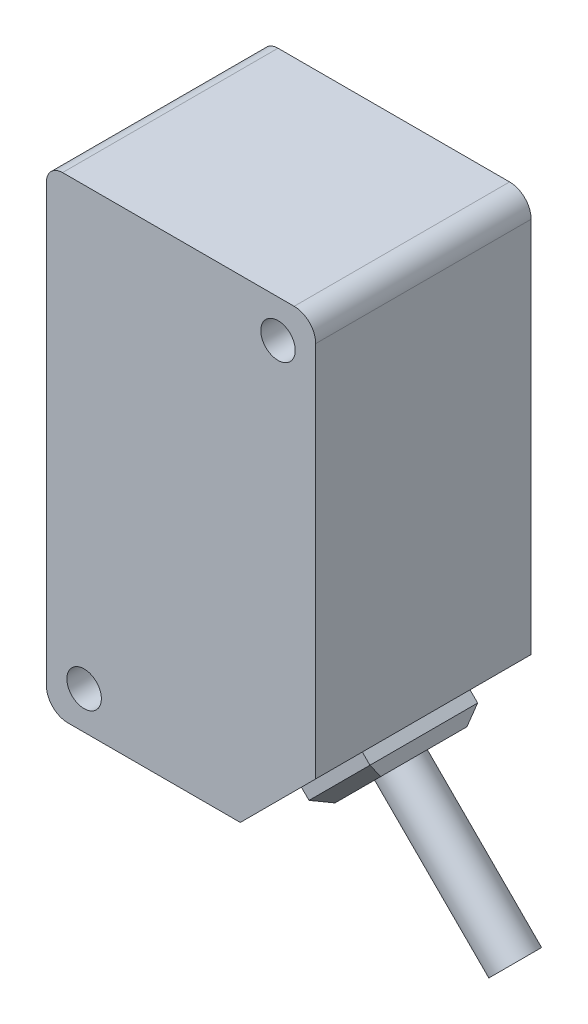
ISO-10303-21;
HEADER;
FILE_DESCRIPTION(('STEP AP214'),'2;1');
FILE_NAME('part.step','',(''),(''),'','','');
FILE_SCHEMA(('AUTOMOTIVE_DESIGN { 1 0 10303 214 1 1 1 1 }'));
ENDSEC;
DATA;
#1=APPLICATION_CONTEXT('core data for automotive mechanical design processes');
#2=APPLICATION_PROTOCOL_DEFINITION('international standard','automotive_design',2000,#1);
#3=PRODUCT_CONTEXT('',#1,'mechanical');
#4=PRODUCT('Part','Part','',(#3));
#5=PRODUCT_RELATED_PRODUCT_CATEGORY('part','',(#4));
#6=PRODUCT_DEFINITION_FORMATION('','',#4);
#7=PRODUCT_DEFINITION_CONTEXT('part definition',#1,'design');
#8=PRODUCT_DEFINITION('design','',#6,#7);
#9=PRODUCT_DEFINITION_SHAPE('','',#8);
#10=(LENGTH_UNIT() NAMED_UNIT(*) SI_UNIT(.MILLI.,.METRE.));
#11=(NAMED_UNIT(*) PLANE_ANGLE_UNIT() SI_UNIT($,.RADIAN.));
#12=(NAMED_UNIT(*) SI_UNIT($,.STERADIAN.) SOLID_ANGLE_UNIT());
#13=UNCERTAINTY_MEASURE_WITH_UNIT(LENGTH_MEASURE(1.E-05),#10,'distance_accuracy_value','');
#14=(GEOMETRIC_REPRESENTATION_CONTEXT(3) GLOBAL_UNCERTAINTY_ASSIGNED_CONTEXT((#13)) GLOBAL_UNIT_ASSIGNED_CONTEXT((#10,
#11,#12)) REPRESENTATION_CONTEXT('',''));
#15=CARTESIAN_POINT('',(0.,0.,0.));
#16=DIRECTION('',(0.,0.,1.));
#17=DIRECTION('',(1.,0.,0.));
#18=AXIS2_PLACEMENT_3D('',#15,#16,#17);
#19=CARTESIAN_POINT('',(18.,0.,20.));
#20=DIRECTION('',(-0.707106781186549,0.707106781186546,0.));
#21=DIRECTION('',(-0.707106781186546,-0.707106781186549,0.));
#22=AXIS2_PLACEMENT_3D('',#19,#20,#21);
#23=PLANE('',#22);
#24=DIRECTION('',(0.707106781186546,0.707106781186549,0.));
#25=VECTOR('',#24,1.);
#26=CARTESIAN_POINT('',(18.,0.,0.));
#27=LINE('',#26,#25);
#28=CARTESIAN_POINT('',(18.,0.,0.));
#29=VERTEX_POINT('',#28);
#30=CARTESIAN_POINT('',(25.,7.00000000000002,0.));
#31=VERTEX_POINT('',#30);
#32=EDGE_CURVE('E225',#29,#31,#27,.T.);
#33=ORIENTED_EDGE('',*,*,#32,.T.);
#34=DIRECTION('',(0.,0.,-1.));
#35=VECTOR('',#34,1.);
#36=CARTESIAN_POINT('',(25.,7.00000000000002,20.));
#37=LINE('',#36,#35);
#38=CARTESIAN_POINT('',(25.,7.00000000000002,20.));
#39=VERTEX_POINT('',#38);
#40=EDGE_CURVE('E222',#39,#31,#37,.T.);
#41=ORIENTED_EDGE('',*,*,#40,.F.);
#42=DIRECTION('',(0.707106781186546,0.707106781186549,0.));
#43=VECTOR('',#42,1.);
#44=CARTESIAN_POINT('',(18.,0.,20.));
#45=LINE('',#44,#43);
#46=CARTESIAN_POINT('',(18.,0.,20.));
#47=VERTEX_POINT('',#46);
#48=EDGE_CURVE('E207',#47,#39,#45,.T.);
#49=ORIENTED_EDGE('',*,*,#48,.F.);
#50=DIRECTION('',(0.,0.,-1.));
#51=VECTOR('',#50,1.);
#52=CARTESIAN_POINT('',(18.,0.,20.));
#53=LINE('',#52,#51);
#54=EDGE_CURVE('E241',#47,#29,#53,.T.);
#55=ORIENTED_EDGE('',*,*,#54,.T.);
#56=EDGE_LOOP('',(#33,#41,#49,#55));
#57=FACE_BOUND('',#56,.T.);
#58=DIRECTION('',(0.707106781186547,0.707106781186549,0.));
#59=VECTOR('',#58,1.);
#60=CARTESIAN_POINT('',(24.3284271247462,6.32842712474619,5.));
#61=LINE('',#60,#59);
#62=CARTESIAN_POINT('',(18.6715728752538,0.671572875253804,5.));
#63=VERTEX_POINT('',#62);
#64=CARTESIAN_POINT('',(24.3284271247462,6.32842712474619,5.));
#65=VERTEX_POINT('',#64);
#66=EDGE_CURVE('E146',#63,#65,#61,.T.);
#67=ORIENTED_EDGE('',*,*,#66,.F.);
#68=DIRECTION('',(0.,0.,-1.));
#69=VECTOR('',#68,1.);
#70=CARTESIAN_POINT('',(18.6715728752538,0.671572875253804,15.));
#71=LINE('',#70,#69);
#72=CARTESIAN_POINT('',(18.6715728752538,0.671572875253802,15.));
#73=VERTEX_POINT('',#72);
#74=EDGE_CURVE('E152',#73,#63,#71,.T.);
#75=ORIENTED_EDGE('',*,*,#74,.F.);
#76=DIRECTION('',(-0.707106781186547,-0.707106781186549,0.));
#77=VECTOR('',#76,1.);
#78=CARTESIAN_POINT('',(24.3284271247462,6.32842712474619,15.));
#79=LINE('',#78,#77);
#80=CARTESIAN_POINT('',(24.3284271247462,6.32842712474619,15.));
#81=VERTEX_POINT('',#80);
#82=EDGE_CURVE('E165',#81,#73,#79,.T.);
#83=ORIENTED_EDGE('',*,*,#82,.F.);
#84=DIRECTION('',(0.,0.,1.));
#85=VECTOR('',#84,1.);
#86=CARTESIAN_POINT('',(24.3284271247462,6.32842712474619,15.));
#87=LINE('',#86,#85);
#88=EDGE_CURVE('E160',#65,#81,#87,.T.);
#89=ORIENTED_EDGE('',*,*,#88,.F.);
#90=EDGE_LOOP('',(#67,#75,#83,#89));
#91=FACE_BOUND('',#90,.T.);
#92=ADVANCED_FACE('F39',(#57,#91),#23,.F.);
#93=CARTESIAN_POINT('',(0.,0.,20.));
#94=DIRECTION('',(0.,0.,1.));
#95=DIRECTION('',(1.,0.,0.));
#96=AXIS2_PLACEMENT_3D('',#93,#94,#95);
#97=PLANE('',#96);
#98=CARTESIAN_POINT('',(21.5,40.5,20.));
#99=DIRECTION('',(0.,0.,1.));
#100=DIRECTION('',(1.,0.,0.));
#101=AXIS2_PLACEMENT_3D('',#98,#99,#100);
#102=CIRCLE('',#101,1.6);
#103=CARTESIAN_POINT('',(23.1,40.5,20.));
#104=VERTEX_POINT('',#103);
#105=EDGE_CURVE('E196',#104,#104,#102,.T.);
#106=ORIENTED_EDGE('',*,*,#105,.F.);
#107=EDGE_LOOP('',(#106));
#108=FACE_BOUND('',#107,.T.);
#109=DIRECTION('',(0.,-1.,0.));
#110=VECTOR('',#109,1.);
#111=CARTESIAN_POINT('',(0.,0.,20.));
#112=LINE('',#111,#110);
#113=CARTESIAN_POINT('',(0.,42.5,20.));
#114=VERTEX_POINT('',#113);
#115=CARTESIAN_POINT('',(0.,2.,20.));
#116=VERTEX_POINT('',#115);
#117=EDGE_CURVE('E218',#114,#116,#112,.T.);
#118=ORIENTED_EDGE('',*,*,#117,.T.);
#119=CARTESIAN_POINT('',(2.,2.,20.));
#120=DIRECTION('',(0.,0.,1.));
#121=DIRECTION('',(1.,0.,0.));
#122=AXIS2_PLACEMENT_3D('',#119,#120,#121);
#123=CIRCLE('',#122,2.);
#124=CARTESIAN_POINT('',(2.,0.,20.));
#125=VERTEX_POINT('',#124);
#126=EDGE_CURVE('E276',#116,#125,#123,.T.);
#127=ORIENTED_EDGE('',*,*,#126,.T.);
#128=DIRECTION('',(1.,0.,0.));
#129=VECTOR('',#128,1.);
#130=CARTESIAN_POINT('',(0.,0.,20.));
#131=LINE('',#130,#129);
#132=EDGE_CURVE('E204',#125,#47,#131,.T.);
#133=ORIENTED_EDGE('',*,*,#132,.T.);
#134=ORIENTED_EDGE('',*,*,#48,.T.);
#135=DIRECTION('',(0.,1.,0.));
#136=VECTOR('',#135,1.);
#137=CARTESIAN_POINT('',(25.,7.00000000000002,20.));
#138=LINE('',#137,#136);
#139=CARTESIAN_POINT('',(25.,42.,20.));
#140=VERTEX_POINT('',#139);
#141=EDGE_CURVE('E211',#39,#140,#138,.T.);
#142=ORIENTED_EDGE('',*,*,#141,.T.);
#143=CARTESIAN_POINT('',(23.,42.,20.));
#144=DIRECTION('',(0.,0.,1.));
#145=DIRECTION('',(1.,0.,0.));
#146=AXIS2_PLACEMENT_3D('',#143,#144,#145);
#147=CIRCLE('',#146,2.);
#148=CARTESIAN_POINT('',(23.,44.,20.));
#149=VERTEX_POINT('',#148);
#150=EDGE_CURVE('E273',#140,#149,#147,.T.);
#151=ORIENTED_EDGE('',*,*,#150,.T.);
#152=DIRECTION('',(-1.,0.,0.));
#153=VECTOR('',#152,1.);
#154=CARTESIAN_POINT('',(0.,44.,20.));
#155=LINE('',#154,#153);
#156=CARTESIAN_POINT('',(1.49999999999999,44.,20.));
#157=VERTEX_POINT('',#156);
#158=EDGE_CURVE('E215',#149,#157,#155,.T.);
#159=ORIENTED_EDGE('',*,*,#158,.T.);
#160=CARTESIAN_POINT('',(1.49999999999999,42.5,20.));
#161=DIRECTION('',(0.,0.,1.));
#162=DIRECTION('',(1.,0.,0.));
#163=AXIS2_PLACEMENT_3D('',#160,#161,#162);
#164=CIRCLE('',#163,1.5);
#165=EDGE_CURVE('E257',#157,#114,#164,.T.);
#166=ORIENTED_EDGE('',*,*,#165,.T.);
#167=EDGE_LOOP('',(#118,#127,#133,#134,#142,#151,#159,#166));
#168=FACE_BOUND('',#167,.T.);
#169=CARTESIAN_POINT('',(3.5,3.5,20.));
#170=DIRECTION('',(0.,0.,1.));
#171=DIRECTION('',(1.,0.,0.));
#172=AXIS2_PLACEMENT_3D('',#169,#170,#171);
#173=CIRCLE('',#172,1.6);
#174=CARTESIAN_POINT('',(5.1,3.5,20.));
#175=VERTEX_POINT('',#174);
#176=EDGE_CURVE('E188',#175,#175,#173,.T.);
#177=ORIENTED_EDGE('',*,*,#176,.F.);
#178=EDGE_LOOP('',(#177));
#179=FACE_BOUND('',#178,.T.);
#180=ADVANCED_FACE('F348',(#108,#168,#179),#97,.T.);
#181=CARTESIAN_POINT('',(0.,0.,0.));
#182=DIRECTION('',(0.,0.,1.));
#183=DIRECTION('',(1.,0.,0.));
#184=AXIS2_PLACEMENT_3D('',#181,#182,#183);
#185=PLANE('',#184);
#186=DIRECTION('',(1.,0.,0.));
#187=VECTOR('',#186,1.);
#188=CARTESIAN_POINT('',(0.,0.,0.));
#189=LINE('',#188,#187);
#190=CARTESIAN_POINT('',(2.,0.,0.));
#191=VERTEX_POINT('',#190);
#192=EDGE_CURVE('E200',#191,#29,#189,.T.);
#193=ORIENTED_EDGE('',*,*,#192,.F.);
#194=CARTESIAN_POINT('',(2.,2.,0.));
#195=DIRECTION('',(0.,0.,1.));
#196=DIRECTION('',(1.,0.,0.));
#197=AXIS2_PLACEMENT_3D('',#194,#195,#196);
#198=CIRCLE('',#197,2.);
#199=CARTESIAN_POINT('',(0.,2.,0.));
#200=VERTEX_POINT('',#199);
#201=EDGE_CURVE('E267',#191,#200,#198,.F.);
#202=ORIENTED_EDGE('',*,*,#201,.T.);
#203=DIRECTION('',(0.,-1.,0.));
#204=VECTOR('',#203,1.);
#205=CARTESIAN_POINT('',(0.,0.,0.));
#206=LINE('',#205,#204);
#207=CARTESIAN_POINT('',(0.,42.5,0.));
#208=VERTEX_POINT('',#207);
#209=EDGE_CURVE('E208',#208,#200,#206,.T.);
#210=ORIENTED_EDGE('',*,*,#209,.F.);
#211=CARTESIAN_POINT('',(1.49999999999999,42.5,0.));
#212=DIRECTION('',(0.,0.,1.));
#213=DIRECTION('',(1.,0.,0.));
#214=AXIS2_PLACEMENT_3D('',#211,#212,#213);
#215=CIRCLE('',#214,1.5);
#216=CARTESIAN_POINT('',(1.49999999999999,44.,0.));
#217=VERTEX_POINT('',#216);
#218=EDGE_CURVE('E249',#208,#217,#215,.F.);
#219=ORIENTED_EDGE('',*,*,#218,.T.);
#220=DIRECTION('',(-1.,0.,0.));
#221=VECTOR('',#220,1.);
#222=CARTESIAN_POINT('',(0.,44.,0.));
#223=LINE('',#222,#221);
#224=CARTESIAN_POINT('',(23.,44.,0.));
#225=VERTEX_POINT('',#224);
#226=EDGE_CURVE('E232',#225,#217,#223,.T.);
#227=ORIENTED_EDGE('',*,*,#226,.F.);
#228=CARTESIAN_POINT('',(23.,42.,0.));
#229=DIRECTION('',(0.,0.,1.));
#230=DIRECTION('',(1.,0.,0.));
#231=AXIS2_PLACEMENT_3D('',#228,#229,#230);
#232=CIRCLE('',#231,2.);
#233=CARTESIAN_POINT('',(25.,42.,0.));
#234=VERTEX_POINT('',#233);
#235=EDGE_CURVE('E264',#225,#234,#232,.F.);
#236=ORIENTED_EDGE('',*,*,#235,.T.);
#237=DIRECTION('',(0.,1.,0.));
#238=VECTOR('',#237,1.);
#239=CARTESIAN_POINT('',(25.,7.00000000000002,0.));
#240=LINE('',#239,#238);
#241=EDGE_CURVE('E228',#31,#234,#240,.T.);
#242=ORIENTED_EDGE('',*,*,#241,.F.);
#243=ORIENTED_EDGE('',*,*,#32,.F.);
#244=EDGE_LOOP('',(#193,#202,#210,#219,#227,#236,#242,#243));
#245=FACE_BOUND('',#244,.T.);
#246=CARTESIAN_POINT('',(21.5,40.5,0.));
#247=DIRECTION('',(0.,0.,1.));
#248=DIRECTION('',(1.,0.,0.));
#249=AXIS2_PLACEMENT_3D('',#246,#247,#248);
#250=CIRCLE('',#249,1.6);
#251=CARTESIAN_POINT('',(23.1,40.5,0.));
#252=VERTEX_POINT('',#251);
#253=EDGE_CURVE('E192',#252,#252,#250,.T.);
#254=ORIENTED_EDGE('',*,*,#253,.T.);
#255=EDGE_LOOP('',(#254));
#256=FACE_BOUND('',#255,.T.);
#257=CARTESIAN_POINT('',(3.5,3.5,0.));
#258=DIRECTION('',(0.,0.,1.));
#259=DIRECTION('',(1.,0.,0.));
#260=AXIS2_PLACEMENT_3D('',#257,#258,#259);
#261=CIRCLE('',#260,1.6);
#262=CARTESIAN_POINT('',(5.1,3.5,0.));
#263=VERTEX_POINT('',#262);
#264=EDGE_CURVE('E184',#263,#263,#261,.T.);
#265=ORIENTED_EDGE('',*,*,#264,.T.);
#266=EDGE_LOOP('',(#265));
#267=FACE_BOUND('',#266,.T.);
#268=ADVANCED_FACE('F354',(#245,#256,#267),#185,.F.);
#269=CARTESIAN_POINT('',(0.,0.,20.));
#270=DIRECTION('',(0.,1.,0.));
#271=DIRECTION('',(-1.,0.,0.));
#272=AXIS2_PLACEMENT_3D('',#269,#270,#271);
#273=PLANE('',#272);
#274=ORIENTED_EDGE('',*,*,#132,.F.);
#275=DIRECTION('',(0.,0.,-1.));
#276=VECTOR('',#275,1.);
#277=CARTESIAN_POINT('',(2.,0.,20.));
#278=LINE('',#277,#276);
#279=EDGE_CURVE('E260',#125,#191,#278,.T.);
#280=ORIENTED_EDGE('',*,*,#279,.T.);
#281=ORIENTED_EDGE('',*,*,#192,.T.);
#282=ORIENTED_EDGE('',*,*,#54,.F.);
#283=EDGE_LOOP('',(#274,#280,#281,#282));
#284=FACE_BOUND('',#283,.T.);
#285=ADVANCED_FACE('F361',(#284),#273,.F.);
#286=CARTESIAN_POINT('',(25.,7.00000000000002,20.));
#287=DIRECTION('',(-1.,0.,0.));
#288=DIRECTION('',(0.,-1.,0.));
#289=AXIS2_PLACEMENT_3D('',#286,#287,#288);
#290=PLANE('',#289);
#291=ORIENTED_EDGE('',*,*,#241,.T.);
#292=DIRECTION('',(0.,0.,-1.));
#293=VECTOR('',#292,1.);
#294=CARTESIAN_POINT('',(25.,42.,20.));
#295=LINE('',#294,#293);
#296=EDGE_CURVE('E283',#234,#140,#295,.F.);
#297=ORIENTED_EDGE('',*,*,#296,.T.);
#298=ORIENTED_EDGE('',*,*,#141,.F.);
#299=ORIENTED_EDGE('',*,*,#40,.T.);
#300=EDGE_LOOP('',(#291,#297,#298,#299));
#301=FACE_BOUND('',#300,.T.);
#302=ADVANCED_FACE('F359',(#301),#290,.F.);
#303=CARTESIAN_POINT('',(0.,44.,20.));
#304=DIRECTION('',(0.,-1.,0.));
#305=DIRECTION('',(0.,0.,-1.));
#306=AXIS2_PLACEMENT_3D('',#303,#304,#305);
#307=PLANE('',#306);
#308=ORIENTED_EDGE('',*,*,#158,.F.);
#309=DIRECTION('',(0.,0.,-1.));
#310=VECTOR('',#309,1.);
#311=CARTESIAN_POINT('',(23.,44.,20.));
#312=LINE('',#311,#310);
#313=EDGE_CURVE('E279',#149,#225,#312,.T.);
#314=ORIENTED_EDGE('',*,*,#313,.T.);
#315=ORIENTED_EDGE('',*,*,#226,.T.);
#316=DIRECTION('',(0.,0.,-1.));
#317=VECTOR('',#316,1.);
#318=CARTESIAN_POINT('',(1.49999999999999,44.,20.));
#319=LINE('',#318,#317);
#320=EDGE_CURVE('E253',#217,#157,#319,.F.);
#321=ORIENTED_EDGE('',*,*,#320,.T.);
#322=EDGE_LOOP('',(#308,#314,#315,#321));
#323=FACE_BOUND('',#322,.T.);
#324=ADVANCED_FACE('F517',(#323),#307,.F.);
#325=CARTESIAN_POINT('',(0.,0.,20.));
#326=DIRECTION('',(1.,0.,0.));
#327=DIRECTION('',(0.,1.,0.));
#328=AXIS2_PLACEMENT_3D('',#325,#326,#327);
#329=PLANE('',#328);
#330=CARTESIAN_POINT('',(0.,37.7,10.));
#331=DIRECTION('',(-1.,0.,0.));
#332=DIRECTION('',(0.,-1.,0.));
#333=AXIS2_PLACEMENT_3D('',#330,#331,#332);
#334=CIRCLE('',#333,1.6);
#335=CARTESIAN_POINT('',(0.,36.1,10.));
#336=VERTEX_POINT('',#335);
#337=EDGE_CURVE('E179',#336,#336,#334,.T.);
#338=ORIENTED_EDGE('',*,*,#337,.F.);
#339=EDGE_LOOP('',(#338));
#340=FACE_BOUND('',#339,.T.);
#341=ORIENTED_EDGE('',*,*,#209,.T.);
#342=DIRECTION('',(0.,0.,-1.));
#343=VECTOR('',#342,1.);
#344=CARTESIAN_POINT('',(0.,2.,20.));
#345=LINE('',#344,#343);
#346=EDGE_CURVE('E270',#200,#116,#345,.F.);
#347=ORIENTED_EDGE('',*,*,#346,.T.);
#348=ORIENTED_EDGE('',*,*,#117,.F.);
#349=DIRECTION('',(0.,0.,-1.));
#350=VECTOR('',#349,1.);
#351=CARTESIAN_POINT('',(0.,42.5,20.));
#352=LINE('',#351,#350);
#353=EDGE_CURVE('E245',#114,#208,#352,.T.);
#354=ORIENTED_EDGE('',*,*,#353,.T.);
#355=EDGE_LOOP('',(#341,#347,#348,#354));
#356=FACE_BOUND('',#355,.T.);
#357=ADVANCED_FACE('F509',(#340,#356),#329,.F.);
#358=CARTESIAN_POINT('',(21.5,40.5,20.));
#359=DIRECTION('',(0.,0.,-1.));
#360=DIRECTION('',(-1.,0.,0.));
#361=AXIS2_PLACEMENT_3D('',#358,#359,#360);
#362=CYLINDRICAL_SURFACE('',#361,1.6);
#363=ORIENTED_EDGE('',*,*,#105,.T.);
#364=EDGE_LOOP('',(#363));
#365=FACE_BOUND('',#364,.T.);
#366=ORIENTED_EDGE('',*,*,#253,.F.);
#367=EDGE_LOOP('',(#366));
#368=FACE_BOUND('',#367,.T.);
#369=ADVANCED_FACE('F500',(#365,#368),#362,.F.);
#370=CARTESIAN_POINT('',(3.5,3.5,20.));
#371=DIRECTION('',(0.,0.,-1.));
#372=DIRECTION('',(-1.,0.,0.));
#373=AXIS2_PLACEMENT_3D('',#370,#371,#372);
#374=CYLINDRICAL_SURFACE('',#373,1.6);
#375=ORIENTED_EDGE('',*,*,#176,.T.);
#376=EDGE_LOOP('',(#375));
#377=FACE_BOUND('',#376,.T.);
#378=ORIENTED_EDGE('',*,*,#264,.F.);
#379=EDGE_LOOP('',(#378));
#380=FACE_BOUND('',#379,.T.);
#381=ADVANCED_FACE('F491',(#377,#380),#374,.F.);
#382=CARTESIAN_POINT('',(0.999999999999994,37.7,10.));
#383=DIRECTION('',(-1.,0.,0.));
#384=DIRECTION('',(0.,-1.,0.));
#385=AXIS2_PLACEMENT_3D('',#382,#383,#384);
#386=CYLINDRICAL_SURFACE('',#385,1.6);
#387=CARTESIAN_POINT('',(0.999999999999994,37.7,10.));
#388=DIRECTION('',(-1.,0.,0.));
#389=DIRECTION('',(0.,-1.,0.));
#390=AXIS2_PLACEMENT_3D('',#387,#388,#389);
#391=CIRCLE('',#390,1.6);
#392=CARTESIAN_POINT('',(0.999999999999994,36.1,10.));
#393=VERTEX_POINT('',#392);
#394=EDGE_CURVE('E180',#393,#393,#391,.T.);
#395=ORIENTED_EDGE('',*,*,#394,.F.);
#396=EDGE_LOOP('',(#395));
#397=FACE_BOUND('',#396,.T.);
#398=ORIENTED_EDGE('',*,*,#337,.T.);
#399=EDGE_LOOP('',(#398));
#400=FACE_BOUND('',#399,.T.);
#401=ADVANCED_FACE('F482',(#397,#400),#386,.F.);
#402=CARTESIAN_POINT('',(0.999999999999994,37.7,10.));
#403=DIRECTION('',(-1.,0.,0.));
#404=DIRECTION('',(0.,-1.,0.));
#405=AXIS2_PLACEMENT_3D('',#402,#403,#404);
#406=PLANE('',#405);
#407=ORIENTED_EDGE('',*,*,#394,.T.);
#408=EDGE_LOOP('',(#407));
#409=FACE_BOUND('',#408,.T.);
#410=ADVANCED_FACE('F369',(#409),#406,.T.);
#411=CARTESIAN_POINT('',(1.49999999999999,42.5,20.));
#412=DIRECTION('',(0.,0.,-1.));
#413=DIRECTION('',(-1.,0.,0.));
#414=AXIS2_PLACEMENT_3D('',#411,#412,#413);
#415=CYLINDRICAL_SURFACE('',#414,1.5);
#416=ORIENTED_EDGE('',*,*,#165,.F.);
#417=ORIENTED_EDGE('',*,*,#320,.F.);
#418=ORIENTED_EDGE('',*,*,#218,.F.);
#419=ORIENTED_EDGE('',*,*,#353,.F.);
#420=EDGE_LOOP('',(#416,#417,#418,#419));
#421=FACE_BOUND('',#420,.T.);
#422=ADVANCED_FACE('F365',(#421),#415,.T.);
#423=CARTESIAN_POINT('',(2.,2.,20.));
#424=DIRECTION('',(0.,0.,-1.));
#425=DIRECTION('',(-1.,0.,0.));
#426=AXIS2_PLACEMENT_3D('',#423,#424,#425);
#427=CYLINDRICAL_SURFACE('',#426,2.);
#428=ORIENTED_EDGE('',*,*,#126,.F.);
#429=ORIENTED_EDGE('',*,*,#346,.F.);
#430=ORIENTED_EDGE('',*,*,#201,.F.);
#431=ORIENTED_EDGE('',*,*,#279,.F.);
#432=EDGE_LOOP('',(#428,#429,#430,#431));
#433=FACE_BOUND('',#432,.T.);
#434=ADVANCED_FACE('F368',(#433),#427,.T.);
#435=CARTESIAN_POINT('',(23.,42.,20.));
#436=DIRECTION('',(0.,0.,-1.));
#437=DIRECTION('',(-1.,0.,0.));
#438=AXIS2_PLACEMENT_3D('',#435,#436,#437);
#439=CYLINDRICAL_SURFACE('',#438,2.);
#440=ORIENTED_EDGE('',*,*,#150,.F.);
#441=ORIENTED_EDGE('',*,*,#296,.F.);
#442=ORIENTED_EDGE('',*,*,#235,.F.);
#443=ORIENTED_EDGE('',*,*,#313,.F.);
#444=EDGE_LOOP('',(#440,#441,#442,#443));
#445=FACE_BOUND('',#444,.T.);
#446=ADVANCED_FACE('F373',(#445),#439,.T.);
#447=CARTESIAN_POINT('',(25.7426406871193,4.9142135623731,5.));
#448=DIRECTION('',(0.,0.,1.));
#449=DIRECTION('',(0.,-1.,0.));
#450=AXIS2_PLACEMENT_3D('',#447,#448,#449);
#451=PLANE('',#450);
#452=DIRECTION('',(-0.707106781186549,0.707106781186546,0.));
#453=VECTOR('',#452,1.);
#454=CARTESIAN_POINT('',(25.7426406871193,4.9142135623731,5.));
#455=LINE('',#454,#453);
#456=CARTESIAN_POINT('',(25.0355339059327,5.62132034355966,5.));
#457=VERTEX_POINT('',#456);
#458=EDGE_CURVE('E176',#457,#65,#455,.T.);
#459=ORIENTED_EDGE('',*,*,#458,.F.);
#460=DIRECTION('',(-0.707106781186547,-0.707106781186549,0.));
#461=VECTOR('',#460,1.);
#462=CARTESIAN_POINT('',(19.3786796564403,-0.0355339059327314,5.));
#463=LINE('',#462,#461);
#464=CARTESIAN_POINT('',(19.3786796564403,-0.0355339059327321,5.));
#465=VERTEX_POINT('',#464);
#466=EDGE_CURVE('E148',#457,#465,#463,.T.);
#467=ORIENTED_EDGE('',*,*,#466,.T.);
#468=DIRECTION('',(-0.707106781186549,0.707106781186546,0.));
#469=VECTOR('',#468,1.);
#470=CARTESIAN_POINT('',(20.0857864376269,-0.742640687119289,5.));
#471=LINE('',#470,#469);
#472=EDGE_CURVE('E142',#465,#63,#471,.T.);
#473=ORIENTED_EDGE('',*,*,#472,.T.);
#474=ORIENTED_EDGE('',*,*,#66,.T.);
#475=EDGE_LOOP('',(#459,#467,#473,#474));
#476=FACE_BOUND('',#475,.T.);
#477=ADVANCED_FACE('F145',(#476),#451,.F.);
#478=CARTESIAN_POINT('',(25.7426406871193,4.9142135623731,15.));
#479=DIRECTION('',(-0.707106781186546,-0.707106781186549,0.));
#480=DIRECTION('',(0.707106781186549,-0.707106781186546,0.));
#481=AXIS2_PLACEMENT_3D('',#478,#479,#480);
#482=PLANE('',#481);
#483=DIRECTION('',(-0.707106781186549,0.707106781186546,0.));
#484=VECTOR('',#483,1.);
#485=CARTESIAN_POINT('',(25.7426406871193,4.9142135623731,15.));
#486=LINE('',#485,#484);
#487=CARTESIAN_POINT('',(25.0355339059327,5.62132034355966,15.));
#488=VERTEX_POINT('',#487);
#489=EDGE_CURVE('E173',#488,#81,#486,.T.);
#490=ORIENTED_EDGE('',*,*,#489,.F.);
#491=DIRECTION('',(0.,0.,-1.));
#492=VECTOR('',#491,1.);
#493=CARTESIAN_POINT('',(25.0355339059327,5.62132034355966,5.));
#494=LINE('',#493,#492);
#495=EDGE_CURVE('E11',#488,#457,#494,.T.);
#496=ORIENTED_EDGE('',*,*,#495,.T.);
#497=ORIENTED_EDGE('',*,*,#458,.T.);
#498=ORIENTED_EDGE('',*,*,#88,.T.);
#499=EDGE_LOOP('',(#490,#496,#497,#498));
#500=FACE_BOUND('',#499,.T.);
#501=ADVANCED_FACE('F330',(#500),#482,.F.);
#502=CARTESIAN_POINT('',(25.7426406871193,4.9142135623731,15.));
#503=DIRECTION('',(0.,0.,-1.));
#504=DIRECTION('',(0.,1.,0.));
#505=AXIS2_PLACEMENT_3D('',#502,#503,#504);
#506=PLANE('',#505);
#507=DIRECTION('',(-0.707106781186549,0.707106781186546,0.));
#508=VECTOR('',#507,1.);
#509=CARTESIAN_POINT('',(20.0857864376269,-0.742640687119289,15.));
#510=LINE('',#509,#508);
#511=CARTESIAN_POINT('',(19.3786796564403,-0.0355339059327353,15.));
#512=VERTEX_POINT('',#511);
#513=EDGE_CURVE('E151',#512,#73,#510,.T.);
#514=ORIENTED_EDGE('',*,*,#513,.F.);
#515=DIRECTION('',(0.707106781186547,0.707106781186549,0.));
#516=VECTOR('',#515,1.);
#517=CARTESIAN_POINT('',(25.0355339059327,5.62132034355966,15.));
#518=LINE('',#517,#516);
#519=EDGE_CURVE('E49',#512,#488,#518,.T.);
#520=ORIENTED_EDGE('',*,*,#519,.T.);
#521=ORIENTED_EDGE('',*,*,#489,.T.);
#522=ORIENTED_EDGE('',*,*,#82,.T.);
#523=EDGE_LOOP('',(#514,#520,#521,#522));
#524=FACE_BOUND('',#523,.T.);
#525=ADVANCED_FACE('F343',(#524),#506,.F.);
#526=CARTESIAN_POINT('',(20.0857864376269,-0.742640687119289,15.));
#527=DIRECTION('',(0.707106781186546,0.707106781186549,0.));
#528=DIRECTION('',(-0.707106781186549,0.707106781186546,0.));
#529=AXIS2_PLACEMENT_3D('',#526,#527,#528);
#530=PLANE('',#529);
#531=ORIENTED_EDGE('',*,*,#472,.F.);
#532=DIRECTION('',(0.,0.,1.));
#533=VECTOR('',#532,1.);
#534=CARTESIAN_POINT('',(19.3786796564403,-0.035533905932732,15.));
#535=LINE('',#534,#533);
#536=EDGE_CURVE('E64',#465,#512,#535,.T.);
#537=ORIENTED_EDGE('',*,*,#536,.T.);
#538=ORIENTED_EDGE('',*,*,#513,.T.);
#539=ORIENTED_EDGE('',*,*,#74,.T.);
#540=EDGE_LOOP('',(#531,#537,#538,#539));
#541=FACE_BOUND('',#540,.T.);
#542=ADVANCED_FACE('F163',(#541),#530,.F.);
#543=CARTESIAN_POINT('',(10.4142135623731,-10.4142135623731,0.));
#544=DIRECTION('',(0.707106781186549,-0.707106781186547,0.));
#545=DIRECTION('',(0.707106781186547,0.707106781186549,0.));
#546=AXIS2_PLACEMENT_3D('',#543,#544,#545);
#547=PLANE('',#546);
#548=CARTESIAN_POINT('',(22.9142135623731,2.0857864376269,10.));
#549=DIRECTION('',(0.707106781186548,-0.707106781186547,0.));
#550=DIRECTION('',(0.707106781186547,0.707106781186548,0.));
#551=AXIS2_PLACEMENT_3D('',#548,#549,#550);
#552=CIRCLE('',#551,2.);
#553=CARTESIAN_POINT('',(24.3284271247462,3.5,10.));
#554=VERTEX_POINT('',#553);
#555=EDGE_CURVE('E605',#554,#554,#552,.T.);
#556=ORIENTED_EDGE('',*,*,#555,.F.);
#557=EDGE_LOOP('',(#556));
#558=FACE_BOUND('',#557,.T.);
#559=DIRECTION('',(0.,0.,-1.));
#560=VECTOR('',#559,1.);
#561=CARTESIAN_POINT('',(20.7928932188135,-0.0355339059327365,5.));
#562=LINE('',#561,#560);
#563=CARTESIAN_POINT('',(20.7928932188135,-0.0355339059327368,14.));
#564=VERTEX_POINT('',#563);
#565=CARTESIAN_POINT('',(20.7928932188135,-0.035533905932736,6.00000000000001));
#566=VERTEX_POINT('',#565);
#567=EDGE_CURVE('E292',#564,#566,#562,.T.);
#568=ORIENTED_EDGE('',*,*,#567,.T.);
#569=DIRECTION('',(0.707106781186547,0.707106781186549,0.));
#570=VECTOR('',#569,1.);
#571=CARTESIAN_POINT('',(25.7426406871193,4.9142135623731,6.00000000000001));
#572=LINE('',#571,#570);
#573=CARTESIAN_POINT('',(25.0355339059327,4.20710678118655,6.00000000000001));
#574=VERTEX_POINT('',#573);
#575=EDGE_CURVE('E295',#566,#574,#572,.T.);
#576=ORIENTED_EDGE('',*,*,#575,.T.);
#577=DIRECTION('',(0.,0.,1.));
#578=VECTOR('',#577,1.);
#579=CARTESIAN_POINT('',(25.0355339059327,4.20710678118655,15.));
#580=LINE('',#579,#578);
#581=CARTESIAN_POINT('',(25.0355339059327,4.20710678118655,14.));
#582=VERTEX_POINT('',#581);
#583=EDGE_CURVE('E286',#574,#582,#580,.T.);
#584=ORIENTED_EDGE('',*,*,#583,.T.);
#585=DIRECTION('',(-0.707106781186547,-0.707106781186549,0.));
#586=VECTOR('',#585,1.);
#587=CARTESIAN_POINT('',(20.0857864376269,-0.742640687119289,14.));
#588=LINE('',#587,#586);
#589=EDGE_CURVE('E289',#582,#564,#588,.T.);
#590=ORIENTED_EDGE('',*,*,#589,.T.);
#591=EDGE_LOOP('',(#568,#576,#584,#590));
#592=FACE_BOUND('',#591,.T.);
#593=ADVANCED_FACE('F335',(#558,#592),#547,.T.);
#594=CARTESIAN_POINT('',(10.4142135623731,-10.4142135623731,14.));
#595=DIRECTION('',(0.499999999999999,-0.499999999999998,0.707106781186549));
#596=DIRECTION('',(0.707106781186547,0.707106781186549,0.));
#597=AXIS2_PLACEMENT_3D('',#594,#595,#596);
#598=PLANE('',#597);
#599=DIRECTION('',(0.,-0.816496580927726,-0.577350269189626));
#600=VECTOR('',#599,1.);
#601=CARTESIAN_POINT('',(25.0355339059328,-2.39255650988789,9.33333333333333));
#602=LINE('',#601,#600);
#603=EDGE_CURVE('E311',#488,#582,#602,.T.);
#604=ORIENTED_EDGE('',*,*,#603,.F.);
#605=ORIENTED_EDGE('',*,*,#519,.F.);
#606=DIRECTION('',(0.816496580927726,0.,-0.577350269189626));
#607=VECTOR('',#606,1.);
#608=CARTESIAN_POINT('',(13.8737734478533,-0.035533905932715,18.8925565098879));
#609=LINE('',#608,#607);
#610=EDGE_CURVE('E43',#564,#512,#609,.F.);
#611=ORIENTED_EDGE('',*,*,#610,.F.);
#612=ORIENTED_EDGE('',*,*,#589,.F.);
#613=EDGE_LOOP('',(#604,#605,#611,#612));
#614=FACE_BOUND('',#613,.T.);
#615=ADVANCED_FACE('F41',(#614),#598,.T.);
#616=CARTESIAN_POINT('',(20.7928932188135,-0.0355339059327359,0.));
#617=DIRECTION('',(0.,-1.,0.));
#618=DIRECTION('',(0.,0.,1.));
#619=AXIS2_PLACEMENT_3D('',#616,#617,#618);
#620=PLANE('',#619);
#621=ORIENTED_EDGE('',*,*,#610,.T.);
#622=ORIENTED_EDGE('',*,*,#536,.F.);
#623=DIRECTION('',(0.816496580927727,0.,0.577350269189625));
#624=VECTOR('',#623,1.);
#625=CARTESIAN_POINT('',(17.9644660940673,-0.0355339059327278,4.00000000000001));
#626=LINE('',#625,#624);
#627=EDGE_CURVE('E308',#566,#465,#626,.F.);
#628=ORIENTED_EDGE('',*,*,#627,.F.);
#629=ORIENTED_EDGE('',*,*,#567,.F.);
#630=EDGE_LOOP('',(#621,#622,#628,#629));
#631=FACE_BOUND('',#630,.T.);
#632=ADVANCED_FACE('F323',(#631),#620,.T.);
#633=CARTESIAN_POINT('',(25.0355339059327,4.20710678118655,0.));
#634=DIRECTION('',(1.,0.,0.));
#635=DIRECTION('',(0.,0.,-1.));
#636=AXIS2_PLACEMENT_3D('',#633,#634,#635);
#637=PLANE('',#636);
#638=ORIENTED_EDGE('',*,*,#603,.T.);
#639=ORIENTED_EDGE('',*,*,#583,.F.);
#640=DIRECTION('',(0.,0.816496580927727,-0.577350269189624));
#641=VECTOR('',#640,1.);
#642=CARTESIAN_POINT('',(25.0355339059327,7.03553390593274,4.00000000000002));
#643=LINE('',#642,#641);
#644=EDGE_CURVE('E305',#457,#574,#643,.F.);
#645=ORIENTED_EDGE('',*,*,#644,.F.);
#646=ORIENTED_EDGE('',*,*,#495,.F.);
#647=EDGE_LOOP('',(#638,#639,#645,#646));
#648=FACE_BOUND('',#647,.T.);
#649=ADVANCED_FACE('F328',(#648),#637,.T.);
#650=CARTESIAN_POINT('',(10.4142135623731,-10.4142135623731,6.));
#651=DIRECTION('',(0.499999999999999,-0.499999999999998,-0.70710678118655));
#652=DIRECTION('',(-0.707106781186547,-0.707106781186549,0.));
#653=AXIS2_PLACEMENT_3D('',#650,#651,#652);
#654=PLANE('',#653);
#655=ORIENTED_EDGE('',*,*,#627,.T.);
#656=ORIENTED_EDGE('',*,*,#466,.F.);
#657=ORIENTED_EDGE('',*,*,#644,.T.);
#658=ORIENTED_EDGE('',*,*,#575,.F.);
#659=EDGE_LOOP('',(#655,#656,#657,#658));
#660=FACE_BOUND('',#659,.T.);
#661=ADVANCED_FACE('F332',(#660),#654,.T.);
#662=CARTESIAN_POINT('',(33.5208152801713,-8.5208152801713,10.));
#663=DIRECTION('',(-0.707106781186548,0.707106781186547,0.));
#664=DIRECTION('',(-0.707106781186547,-0.707106781186548,0.));
#665=AXIS2_PLACEMENT_3D('',#662,#663,#664);
#666=CYLINDRICAL_SURFACE('',#665,2.);
#667=CARTESIAN_POINT('',(33.5208152801713,-8.5208152801713,10.));
#668=DIRECTION('',(0.707106781186548,-0.707106781186547,0.));
#669=DIRECTION('',(0.707106781186547,0.707106781186548,0.));
#670=AXIS2_PLACEMENT_3D('',#667,#668,#669);
#671=CIRCLE('',#670,2.);
#672=CARTESIAN_POINT('',(34.9350288425444,-7.10660171779821,10.));
#673=VERTEX_POINT('',#672);
#674=EDGE_CURVE('E309',#673,#673,#671,.T.);
#675=ORIENTED_EDGE('',*,*,#674,.F.);
#676=EDGE_LOOP('',(#675));
#677=FACE_BOUND('',#676,.T.);
#678=ORIENTED_EDGE('',*,*,#555,.T.);
#679=EDGE_LOOP('',(#678));
#680=FACE_BOUND('',#679,.T.);
#681=ADVANCED_FACE('F380',(#677,#680),#666,.T.);
#682=CARTESIAN_POINT('',(33.5208152801713,-8.5208152801713,10.));
#683=DIRECTION('',(0.707106781186548,-0.707106781186547,0.));
#684=DIRECTION('',(0.707106781186547,0.707106781186548,0.));
#685=AXIS2_PLACEMENT_3D('',#682,#683,#684);
#686=PLANE('',#685);
#687=ORIENTED_EDGE('',*,*,#674,.T.);
#688=EDGE_LOOP('',(#687));
#689=FACE_BOUND('',#688,.T.);
#690=ADVANCED_FACE('F401',(#689),#686,.T.);
#691=CLOSED_SHELL('',(#92,#180,#268,#285,#302,#324,#357,#369,#381,#401,#410,#422,#434,#446,#477,
#501,#525,#542,#593,#615,#632,#649,#661,#681,#690));
#692=MANIFOLD_SOLID_BREP('B2',#691);
#693=ADVANCED_BREP_SHAPE_REPRESENTATION('',(#18,#692),#14);
#694=SHAPE_DEFINITION_REPRESENTATION(#9,#693);
ENDSEC;
END-ISO-10303-21;
